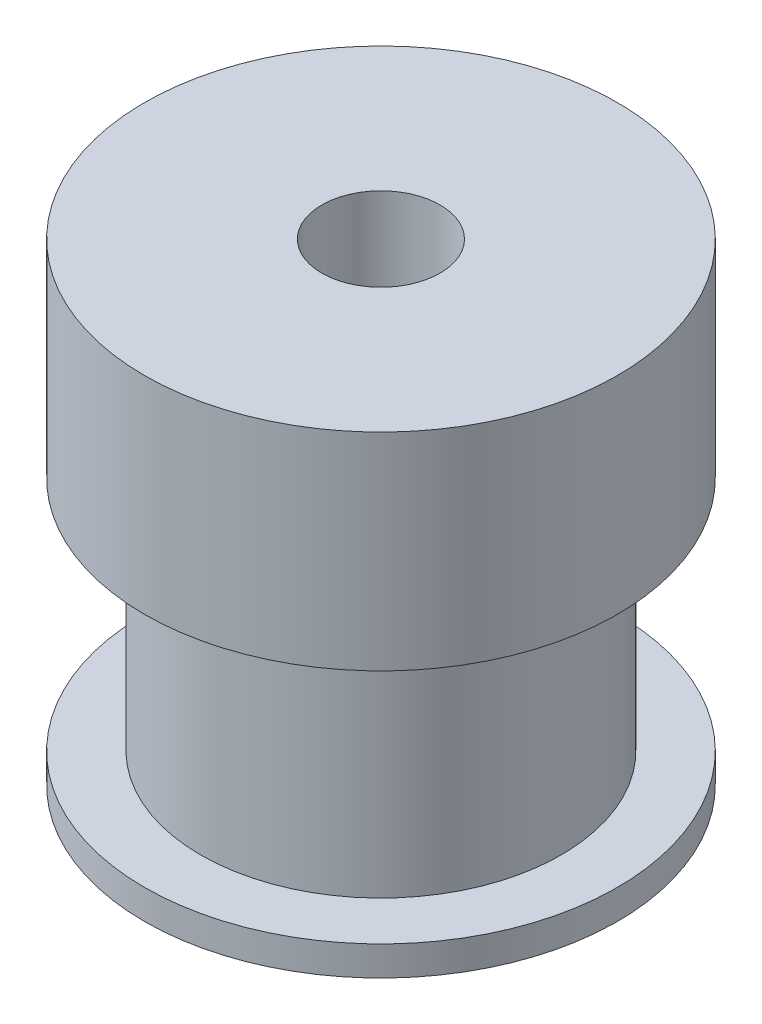
ISO-10303-21;
HEADER;
FILE_DESCRIPTION(('STEP AP214'),'2;1');
FILE_NAME('part.step','',(''),(''),'','','');
FILE_SCHEMA(('AUTOMOTIVE_DESIGN { 1 0 10303 214 1 1 1 1 }'));
ENDSEC;
DATA;
#1=APPLICATION_CONTEXT('core data for automotive mechanical design processes');
#2=APPLICATION_PROTOCOL_DEFINITION('international standard','automotive_design',2000,#1);
#3=PRODUCT_CONTEXT('',#1,'mechanical');
#4=PRODUCT('Part','Part','',(#3));
#5=PRODUCT_RELATED_PRODUCT_CATEGORY('part','',(#4));
#6=PRODUCT_DEFINITION_FORMATION('','',#4);
#7=PRODUCT_DEFINITION_CONTEXT('part definition',#1,'design');
#8=PRODUCT_DEFINITION('design','',#6,#7);
#9=PRODUCT_DEFINITION_SHAPE('','',#8);
#10=(LENGTH_UNIT() NAMED_UNIT(*) SI_UNIT(.MILLI.,.METRE.));
#11=(NAMED_UNIT(*) PLANE_ANGLE_UNIT() SI_UNIT($,.RADIAN.));
#12=(NAMED_UNIT(*) SI_UNIT($,.STERADIAN.) SOLID_ANGLE_UNIT());
#13=UNCERTAINTY_MEASURE_WITH_UNIT(LENGTH_MEASURE(1.E-05),#10,'distance_accuracy_value','');
#14=(GEOMETRIC_REPRESENTATION_CONTEXT(3) GLOBAL_UNCERTAINTY_ASSIGNED_CONTEXT((#13)) GLOBAL_UNIT_ASSIGNED_CONTEXT((#10,
#11,#12)) REPRESENTATION_CONTEXT('',''));
#15=CARTESIAN_POINT('',(0.,0.,0.));
#16=DIRECTION('',(0.,0.,1.));
#17=DIRECTION('',(1.,0.,0.));
#18=AXIS2_PLACEMENT_3D('',#15,#16,#17);
#19=CARTESIAN_POINT('',(0.,1.,0.));
#20=DIRECTION('',(0.,1.,0.));
#21=DIRECTION('',(0.,0.,1.));
#22=AXIS2_PLACEMENT_3D('',#19,#20,#21);
#23=PLANE('',#22);
#24=CARTESIAN_POINT('',(0.,1.,0.));
#25=DIRECTION('',(0.,1.,0.));
#26=DIRECTION('',(0.,0.,1.));
#27=AXIS2_PLACEMENT_3D('',#24,#25,#26);
#28=CIRCLE('',#27,8.);
#29=CARTESIAN_POINT('',(0.,1.,8.));
#30=VERTEX_POINT('',#29);
#31=EDGE_CURVE('E10',#30,#30,#28,.T.);
#32=ORIENTED_EDGE('',*,*,#31,.T.);
#33=EDGE_LOOP('',(#32));
#34=FACE_BOUND('',#33,.T.);
#35=CARTESIAN_POINT('',(0.,1.,0.));
#36=DIRECTION('',(0.,1.,0.));
#37=DIRECTION('',(0.,0.,1.));
#38=AXIS2_PLACEMENT_3D('',#35,#36,#37);
#39=CIRCLE('',#38,6.1);
#40=CARTESIAN_POINT('',(0.,1.,6.1));
#41=VERTEX_POINT('',#40);
#42=EDGE_CURVE('E41',#41,#41,#39,.T.);
#43=ORIENTED_EDGE('',*,*,#42,.F.);
#44=EDGE_LOOP('',(#43));
#45=FACE_BOUND('',#44,.T.);
#46=ADVANCED_FACE('F28',(#34,#45),#23,.T.);
#47=CARTESIAN_POINT('',(0.,1.,0.));
#48=DIRECTION('',(0.,-1.,0.));
#49=DIRECTION('',(0.,0.,-1.));
#50=AXIS2_PLACEMENT_3D('',#47,#48,#49);
#51=CYLINDRICAL_SURFACE('',#50,8.);
#52=ORIENTED_EDGE('',*,*,#31,.F.);
#53=EDGE_LOOP('',(#52));
#54=FACE_BOUND('',#53,.T.);
#55=CARTESIAN_POINT('',(0.,0.,0.));
#56=DIRECTION('',(0.,1.,0.));
#57=DIRECTION('',(0.,0.,1.));
#58=AXIS2_PLACEMENT_3D('',#55,#56,#57);
#59=CIRCLE('',#58,8.);
#60=CARTESIAN_POINT('',(0.,0.,8.));
#61=VERTEX_POINT('',#60);
#62=EDGE_CURVE('E32',#61,#61,#59,.T.);
#63=ORIENTED_EDGE('',*,*,#62,.T.);
#64=EDGE_LOOP('',(#63));
#65=FACE_BOUND('',#64,.T.);
#66=ADVANCED_FACE('F30',(#54,#65),#51,.T.);
#67=CARTESIAN_POINT('',(0.,0.,0.));
#68=DIRECTION('',(0.,1.,0.));
#69=DIRECTION('',(0.,0.,1.));
#70=AXIS2_PLACEMENT_3D('',#67,#68,#69);
#71=PLANE('',#70);
#72=CARTESIAN_POINT('',(0.,0.,0.));
#73=DIRECTION('',(0.,1.,0.));
#74=DIRECTION('',(0.,0.,1.));
#75=AXIS2_PLACEMENT_3D('',#72,#73,#74);
#76=CIRCLE('',#75,2.);
#77=CARTESIAN_POINT('',(0.,0.,2.));
#78=VERTEX_POINT('',#77);
#79=EDGE_CURVE('E50',#78,#78,#76,.T.);
#80=ORIENTED_EDGE('',*,*,#79,.T.);
#81=EDGE_LOOP('',(#80));
#82=FACE_BOUND('',#81,.T.);
#83=ORIENTED_EDGE('',*,*,#62,.F.);
#84=EDGE_LOOP('',(#83));
#85=FACE_BOUND('',#84,.T.);
#86=ADVANCED_FACE('F59',(#82,#85),#71,.F.);
#87=CARTESIAN_POINT('',(0.,9.,0.));
#88=DIRECTION('',(0.,-1.,0.));
#89=DIRECTION('',(0.,0.,-1.));
#90=AXIS2_PLACEMENT_3D('',#87,#88,#89);
#91=CYLINDRICAL_SURFACE('',#90,6.1);
#92=CARTESIAN_POINT('',(0.,9.,0.));
#93=DIRECTION('',(0.,1.,0.));
#94=DIRECTION('',(0.,0.,1.));
#95=AXIS2_PLACEMENT_3D('',#92,#93,#94);
#96=CIRCLE('',#95,6.1);
#97=CARTESIAN_POINT('',(0.,9.,6.1));
#98=VERTEX_POINT('',#97);
#99=EDGE_CURVE('E39',#98,#98,#96,.T.);
#100=ORIENTED_EDGE('',*,*,#99,.F.);
#101=EDGE_LOOP('',(#100));
#102=FACE_BOUND('',#101,.T.);
#103=ORIENTED_EDGE('',*,*,#42,.T.);
#104=EDGE_LOOP('',(#103));
#105=FACE_BOUND('',#104,.T.);
#106=ADVANCED_FACE('F83',(#102,#105),#91,.T.);
#107=CARTESIAN_POINT('',(0.,9.,0.));
#108=DIRECTION('',(0.,1.,0.));
#109=DIRECTION('',(0.,0.,1.));
#110=AXIS2_PLACEMENT_3D('',#107,#108,#109);
#111=PLANE('',#110);
#112=CARTESIAN_POINT('',(0.,9.,0.));
#113=DIRECTION('',(0.,1.,0.));
#114=DIRECTION('',(0.,0.,1.));
#115=AXIS2_PLACEMENT_3D('',#112,#113,#114);
#116=CIRCLE('',#115,8.);
#117=CARTESIAN_POINT('',(0.,9.,8.));
#118=VERTEX_POINT('',#117);
#119=EDGE_CURVE('E47',#118,#118,#116,.T.);
#120=ORIENTED_EDGE('',*,*,#119,.F.);
#121=EDGE_LOOP('',(#120));
#122=FACE_BOUND('',#121,.T.);
#123=ORIENTED_EDGE('',*,*,#99,.T.);
#124=EDGE_LOOP('',(#123));
#125=FACE_BOUND('',#124,.T.);
#126=ADVANCED_FACE('F77',(#122,#125),#111,.F.);
#127=CARTESIAN_POINT('',(0.,16.,0.));
#128=DIRECTION('',(0.,-1.,0.));
#129=DIRECTION('',(0.,0.,-1.));
#130=AXIS2_PLACEMENT_3D('',#127,#128,#129);
#131=CYLINDRICAL_SURFACE('',#130,8.);
#132=CARTESIAN_POINT('',(0.,16.,0.));
#133=DIRECTION('',(0.,1.,0.));
#134=DIRECTION('',(0.,0.,1.));
#135=AXIS2_PLACEMENT_3D('',#132,#133,#134);
#136=CIRCLE('',#135,8.);
#137=CARTESIAN_POINT('',(0.,16.,8.));
#138=VERTEX_POINT('',#137);
#139=EDGE_CURVE('E44',#138,#138,#136,.T.);
#140=ORIENTED_EDGE('',*,*,#139,.F.);
#141=EDGE_LOOP('',(#140));
#142=FACE_BOUND('',#141,.T.);
#143=ORIENTED_EDGE('',*,*,#119,.T.);
#144=EDGE_LOOP('',(#143));
#145=FACE_BOUND('',#144,.T.);
#146=ADVANCED_FACE('F71',(#142,#145),#131,.T.);
#147=CARTESIAN_POINT('',(0.,16.,0.));
#148=DIRECTION('',(0.,1.,0.));
#149=DIRECTION('',(0.,0.,1.));
#150=AXIS2_PLACEMENT_3D('',#147,#148,#149);
#151=PLANE('',#150);
#152=CARTESIAN_POINT('',(0.,16.,0.));
#153=DIRECTION('',(0.,1.,0.));
#154=DIRECTION('',(0.,0.,1.));
#155=AXIS2_PLACEMENT_3D('',#152,#153,#154);
#156=CIRCLE('',#155,2.);
#157=CARTESIAN_POINT('',(0.,16.,2.));
#158=VERTEX_POINT('',#157);
#159=EDGE_CURVE('E53',#158,#158,#156,.T.);
#160=ORIENTED_EDGE('',*,*,#159,.F.);
#161=EDGE_LOOP('',(#160));
#162=FACE_BOUND('',#161,.T.);
#163=ORIENTED_EDGE('',*,*,#139,.T.);
#164=EDGE_LOOP('',(#163));
#165=FACE_BOUND('',#164,.T.);
#166=ADVANCED_FACE('F65',(#162,#165),#151,.T.);
#167=CARTESIAN_POINT('',(0.,0.,0.));
#168=DIRECTION('',(0.,1.,0.));
#169=DIRECTION('',(0.,0.,1.));
#170=AXIS2_PLACEMENT_3D('',#167,#168,#169);
#171=CYLINDRICAL_SURFACE('',#170,2.);
#172=ORIENTED_EDGE('',*,*,#79,.F.);
#173=EDGE_LOOP('',(#172));
#174=FACE_BOUND('',#173,.T.);
#175=ORIENTED_EDGE('',*,*,#159,.T.);
#176=EDGE_LOOP('',(#175));
#177=FACE_BOUND('',#176,.T.);
#178=ADVANCED_FACE('F62',(#174,#177),#171,.F.);
#179=CLOSED_SHELL('',(#46,#66,#86,#106,#126,#146,#166,#178));
#180=MANIFOLD_SOLID_BREP('B2',#179);
#181=ADVANCED_BREP_SHAPE_REPRESENTATION('',(#18,#180),#14);
#182=SHAPE_DEFINITION_REPRESENTATION(#9,#181);
ENDSEC;
END-ISO-10303-21;
